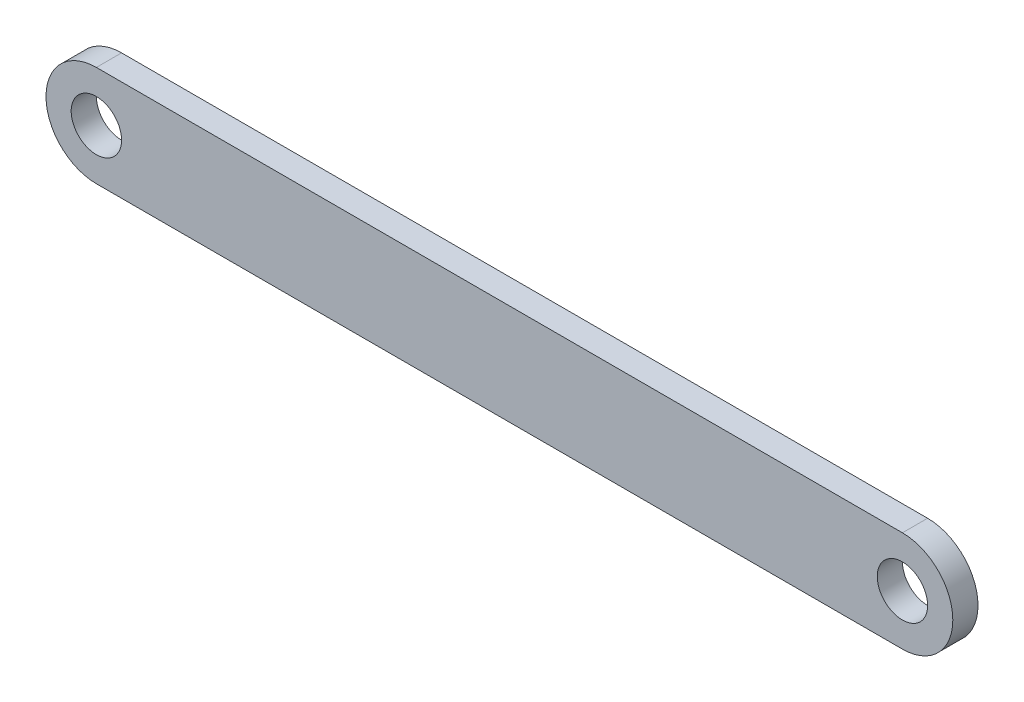
ISO-10303-21;
HEADER;
FILE_DESCRIPTION(('STEP AP214'),'2;1');
FILE_NAME('part.step','',(''),(''),'','','');
FILE_SCHEMA(('AUTOMOTIVE_DESIGN { 1 0 10303 214 1 1 1 1 }'));
ENDSEC;
DATA;
#1=APPLICATION_CONTEXT('core data for automotive mechanical design processes');
#2=APPLICATION_PROTOCOL_DEFINITION('international standard','automotive_design',2000,#1);
#3=PRODUCT_CONTEXT('',#1,'mechanical');
#4=PRODUCT('Part','Part','',(#3));
#5=PRODUCT_RELATED_PRODUCT_CATEGORY('part','',(#4));
#6=PRODUCT_DEFINITION_FORMATION('','',#4);
#7=PRODUCT_DEFINITION_CONTEXT('part definition',#1,'design');
#8=PRODUCT_DEFINITION('design','',#6,#7);
#9=PRODUCT_DEFINITION_SHAPE('','',#8);
#10=(LENGTH_UNIT() NAMED_UNIT(*) SI_UNIT(.MILLI.,.METRE.));
#11=(NAMED_UNIT(*) PLANE_ANGLE_UNIT() SI_UNIT($,.RADIAN.));
#12=(NAMED_UNIT(*) SI_UNIT($,.STERADIAN.) SOLID_ANGLE_UNIT());
#13=UNCERTAINTY_MEASURE_WITH_UNIT(LENGTH_MEASURE(1.E-05),#10,'distance_accuracy_value','');
#14=(GEOMETRIC_REPRESENTATION_CONTEXT(3) GLOBAL_UNCERTAINTY_ASSIGNED_CONTEXT((#13)) GLOBAL_UNIT_ASSIGNED_CONTEXT((#10,
#11,#12)) REPRESENTATION_CONTEXT('',''));
#15=CARTESIAN_POINT('',(0.,0.,0.));
#16=DIRECTION('',(0.,0.,1.));
#17=DIRECTION('',(1.,0.,0.));
#18=AXIS2_PLACEMENT_3D('',#15,#16,#17);
#19=CARTESIAN_POINT('',(-50.8,0.,3.175));
#20=DIRECTION('',(0.,0.,-1.));
#21=DIRECTION('',(-1.,0.,0.));
#22=AXIS2_PLACEMENT_3D('',#19,#20,#21);
#23=CYLINDRICAL_SURFACE('',#22,6.35);
#24=CARTESIAN_POINT('',(-50.8,0.,0.));
#25=DIRECTION('',(0.,0.,1.));
#26=DIRECTION('',(1.,0.,0.));
#27=AXIS2_PLACEMENT_3D('',#24,#25,#26);
#28=CIRCLE('',#27,6.35);
#29=CARTESIAN_POINT('',(-50.8,6.35,0.));
#30=VERTEX_POINT('',#29);
#31=CARTESIAN_POINT('',(-50.8,-6.35,0.));
#32=VERTEX_POINT('',#31);
#33=EDGE_CURVE('E106',#30,#32,#28,.T.);
#34=ORIENTED_EDGE('',*,*,#33,.T.);
#35=DIRECTION('',(0.,0.,-1.));
#36=VECTOR('',#35,1.);
#37=CARTESIAN_POINT('',(-50.8,-6.35,3.175));
#38=LINE('',#37,#36);
#39=CARTESIAN_POINT('',(-50.8,-6.35,3.175));
#40=VERTEX_POINT('',#39);
#41=EDGE_CURVE('E11',#40,#32,#38,.T.);
#42=ORIENTED_EDGE('',*,*,#41,.F.);
#43=CARTESIAN_POINT('',(-50.8,0.,3.175));
#44=DIRECTION('',(0.,0.,1.));
#45=DIRECTION('',(1.,0.,0.));
#46=AXIS2_PLACEMENT_3D('',#43,#44,#45);
#47=CIRCLE('',#46,6.35);
#48=CARTESIAN_POINT('',(-50.8,6.35,3.175));
#49=VERTEX_POINT('',#48);
#50=EDGE_CURVE('E90',#49,#40,#47,.T.);
#51=ORIENTED_EDGE('',*,*,#50,.F.);
#52=DIRECTION('',(0.,0.,-1.));
#53=VECTOR('',#52,1.);
#54=CARTESIAN_POINT('',(-50.8,6.35,3.175));
#55=LINE('',#54,#53);
#56=EDGE_CURVE('E102',#49,#30,#55,.T.);
#57=ORIENTED_EDGE('',*,*,#56,.T.);
#58=EDGE_LOOP('',(#34,#42,#51,#57));
#59=FACE_BOUND('',#58,.T.);
#60=ADVANCED_FACE('F38',(#59),#23,.T.);
#61=CARTESIAN_POINT('',(-50.8,-6.35,3.175));
#62=DIRECTION('',(0.,1.,0.));
#63=DIRECTION('',(0.,0.,1.));
#64=AXIS2_PLACEMENT_3D('',#61,#62,#63);
#65=PLANE('',#64);
#66=DIRECTION('',(1.,0.,0.));
#67=VECTOR('',#66,1.);
#68=CARTESIAN_POINT('',(-50.8,-6.35,0.));
#69=LINE('',#68,#67);
#70=CARTESIAN_POINT('',(50.8,-6.34999999999998,0.));
#71=VERTEX_POINT('',#70);
#72=EDGE_CURVE('E95',#32,#71,#69,.T.);
#73=ORIENTED_EDGE('',*,*,#72,.T.);
#74=DIRECTION('',(0.,0.,-1.));
#75=VECTOR('',#74,1.);
#76=CARTESIAN_POINT('',(50.8,-6.34999999999998,3.175));
#77=LINE('',#76,#75);
#78=CARTESIAN_POINT('',(50.8,-6.34999999999998,3.175));
#79=VERTEX_POINT('',#78);
#80=EDGE_CURVE('E47',#79,#71,#77,.T.);
#81=ORIENTED_EDGE('',*,*,#80,.F.);
#82=DIRECTION('',(1.,0.,0.));
#83=VECTOR('',#82,1.);
#84=CARTESIAN_POINT('',(-50.8,-6.35,3.175));
#85=LINE('',#84,#83);
#86=EDGE_CURVE('E85',#40,#79,#85,.T.);
#87=ORIENTED_EDGE('',*,*,#86,.F.);
#88=ORIENTED_EDGE('',*,*,#41,.T.);
#89=EDGE_LOOP('',(#73,#81,#87,#88));
#90=FACE_BOUND('',#89,.T.);
#91=ADVANCED_FACE('F94',(#90),#65,.F.);
#92=CARTESIAN_POINT('',(50.8,0.,3.175));
#93=DIRECTION('',(0.,0.,-1.));
#94=DIRECTION('',(-1.,0.,0.));
#95=AXIS2_PLACEMENT_3D('',#92,#93,#94);
#96=CYLINDRICAL_SURFACE('',#95,6.35);
#97=CARTESIAN_POINT('',(50.8,0.,0.));
#98=DIRECTION('',(0.,0.,1.));
#99=DIRECTION('',(1.,0.,0.));
#100=AXIS2_PLACEMENT_3D('',#97,#98,#99);
#101=CIRCLE('',#100,6.35);
#102=CARTESIAN_POINT('',(50.8,6.35,0.));
#103=VERTEX_POINT('',#102);
#104=EDGE_CURVE('E72',#71,#103,#101,.T.);
#105=ORIENTED_EDGE('',*,*,#104,.T.);
#106=DIRECTION('',(0.,0.,-1.));
#107=VECTOR('',#106,1.);
#108=CARTESIAN_POINT('',(50.8,6.35,3.175));
#109=LINE('',#108,#107);
#110=CARTESIAN_POINT('',(50.8,6.35,3.175));
#111=VERTEX_POINT('',#110);
#112=EDGE_CURVE('E97',#111,#103,#109,.T.);
#113=ORIENTED_EDGE('',*,*,#112,.F.);
#114=CARTESIAN_POINT('',(50.8,0.,3.175));
#115=DIRECTION('',(0.,0.,1.));
#116=DIRECTION('',(1.,0.,0.));
#117=AXIS2_PLACEMENT_3D('',#114,#115,#116);
#118=CIRCLE('',#117,6.35);
#119=EDGE_CURVE('E88',#79,#111,#118,.T.);
#120=ORIENTED_EDGE('',*,*,#119,.F.);
#121=ORIENTED_EDGE('',*,*,#80,.T.);
#122=EDGE_LOOP('',(#105,#113,#120,#121));
#123=FACE_BOUND('',#122,.T.);
#124=ADVANCED_FACE('F98',(#123),#96,.T.);
#125=CARTESIAN_POINT('',(-50.8,6.35,3.175));
#126=DIRECTION('',(0.,-1.,0.));
#127=DIRECTION('',(0.,0.,-1.));
#128=AXIS2_PLACEMENT_3D('',#125,#126,#127);
#129=PLANE('',#128);
#130=DIRECTION('',(-1.,0.,0.));
#131=VECTOR('',#130,1.);
#132=CARTESIAN_POINT('',(-50.8,6.35,0.));
#133=LINE('',#132,#131);
#134=EDGE_CURVE('E78',#103,#30,#133,.T.);
#135=ORIENTED_EDGE('',*,*,#134,.T.);
#136=ORIENTED_EDGE('',*,*,#56,.F.);
#137=DIRECTION('',(-1.,0.,0.));
#138=VECTOR('',#137,1.);
#139=CARTESIAN_POINT('',(-50.8,6.35,3.175));
#140=LINE('',#139,#138);
#141=EDGE_CURVE('E55',#111,#49,#140,.T.);
#142=ORIENTED_EDGE('',*,*,#141,.F.);
#143=ORIENTED_EDGE('',*,*,#112,.T.);
#144=EDGE_LOOP('',(#135,#136,#142,#143));
#145=FACE_BOUND('',#144,.T.);
#146=ADVANCED_FACE('F120',(#145),#129,.F.);
#147=CARTESIAN_POINT('',(-50.8,0.,3.175));
#148=DIRECTION('',(0.,0.,1.));
#149=DIRECTION('',(1.,0.,0.));
#150=AXIS2_PLACEMENT_3D('',#147,#148,#149);
#151=PLANE('',#150);
#152=CARTESIAN_POINT('',(-50.8,0.,3.175));
#153=DIRECTION('',(0.,0.,1.));
#154=DIRECTION('',(1.,0.,0.));
#155=AXIS2_PLACEMENT_3D('',#152,#153,#154);
#156=CIRCLE('',#155,3.175);
#157=CARTESIAN_POINT('',(-47.625,0.,3.175));
#158=VERTEX_POINT('',#157);
#159=EDGE_CURVE('E135',#158,#158,#156,.T.);
#160=ORIENTED_EDGE('',*,*,#159,.F.);
#161=EDGE_LOOP('',(#160));
#162=FACE_BOUND('',#161,.T.);
#163=CARTESIAN_POINT('',(50.8,0.,3.175));
#164=DIRECTION('',(0.,0.,1.));
#165=DIRECTION('',(-1.,0.,0.));
#166=AXIS2_PLACEMENT_3D('',#163,#164,#165);
#167=CIRCLE('',#166,3.175);
#168=CARTESIAN_POINT('',(47.625,0.,3.175));
#169=VERTEX_POINT('',#168);
#170=EDGE_CURVE('E127',#169,#169,#167,.T.);
#171=ORIENTED_EDGE('',*,*,#170,.F.);
#172=EDGE_LOOP('',(#171));
#173=FACE_BOUND('',#172,.T.);
#174=ORIENTED_EDGE('',*,*,#50,.T.);
#175=ORIENTED_EDGE('',*,*,#86,.T.);
#176=ORIENTED_EDGE('',*,*,#119,.T.);
#177=ORIENTED_EDGE('',*,*,#141,.T.);
#178=EDGE_LOOP('',(#174,#175,#176,#177));
#179=FACE_BOUND('',#178,.T.);
#180=ADVANCED_FACE('F86',(#162,#173,#179),#151,.T.);
#181=CARTESIAN_POINT('',(-50.8,0.,0.));
#182=DIRECTION('',(0.,0.,1.));
#183=DIRECTION('',(1.,0.,0.));
#184=AXIS2_PLACEMENT_3D('',#181,#182,#183);
#185=PLANE('',#184);
#186=CARTESIAN_POINT('',(-50.8,0.,0.));
#187=DIRECTION('',(0.,0.,1.));
#188=DIRECTION('',(1.,0.,0.));
#189=AXIS2_PLACEMENT_3D('',#186,#187,#188);
#190=CIRCLE('',#189,3.175);
#191=CARTESIAN_POINT('',(-47.625,0.,0.));
#192=VERTEX_POINT('',#191);
#193=EDGE_CURVE('E110',#192,#192,#190,.T.);
#194=ORIENTED_EDGE('',*,*,#193,.T.);
#195=EDGE_LOOP('',(#194));
#196=FACE_BOUND('',#195,.T.);
#197=CARTESIAN_POINT('',(50.8,0.,0.));
#198=DIRECTION('',(0.,0.,1.));
#199=DIRECTION('',(-1.,0.,0.));
#200=AXIS2_PLACEMENT_3D('',#197,#198,#199);
#201=CIRCLE('',#200,3.175);
#202=CARTESIAN_POINT('',(47.625,0.,0.));
#203=VERTEX_POINT('',#202);
#204=EDGE_CURVE('E131',#203,#203,#201,.T.);
#205=ORIENTED_EDGE('',*,*,#204,.T.);
#206=EDGE_LOOP('',(#205));
#207=FACE_BOUND('',#206,.T.);
#208=ORIENTED_EDGE('',*,*,#33,.F.);
#209=ORIENTED_EDGE('',*,*,#134,.F.);
#210=ORIENTED_EDGE('',*,*,#104,.F.);
#211=ORIENTED_EDGE('',*,*,#72,.F.);
#212=EDGE_LOOP('',(#208,#209,#210,#211));
#213=FACE_BOUND('',#212,.T.);
#214=ADVANCED_FACE('F123',(#196,#207,#213),#185,.F.);
#215=CARTESIAN_POINT('',(50.8,0.,0.));
#216=DIRECTION('',(0.,0.,1.));
#217=DIRECTION('',(1.,0.,0.));
#218=AXIS2_PLACEMENT_3D('',#215,#216,#217);
#219=CYLINDRICAL_SURFACE('',#218,3.175);
#220=ORIENTED_EDGE('',*,*,#204,.F.);
#221=EDGE_LOOP('',(#220));
#222=FACE_BOUND('',#221,.T.);
#223=ORIENTED_EDGE('',*,*,#170,.T.);
#224=EDGE_LOOP('',(#223));
#225=FACE_BOUND('',#224,.T.);
#226=ADVANCED_FACE('F148',(#222,#225),#219,.F.);
#227=CARTESIAN_POINT('',(-50.8,0.,0.));
#228=DIRECTION('',(0.,0.,1.));
#229=DIRECTION('',(1.,0.,0.));
#230=AXIS2_PLACEMENT_3D('',#227,#228,#229);
#231=CYLINDRICAL_SURFACE('',#230,3.175);
#232=ORIENTED_EDGE('',*,*,#193,.F.);
#233=EDGE_LOOP('',(#232));
#234=FACE_BOUND('',#233,.T.);
#235=ORIENTED_EDGE('',*,*,#159,.T.);
#236=EDGE_LOOP('',(#235));
#237=FACE_BOUND('',#236,.T.);
#238=ADVANCED_FACE('F145',(#234,#237),#231,.F.);
#239=CLOSED_SHELL('',(#60,#91,#124,#146,#180,#214,#226,#238));
#240=MANIFOLD_SOLID_BREP('B2',#239);
#241=ADVANCED_BREP_SHAPE_REPRESENTATION('',(#18,#240),#14);
#242=SHAPE_DEFINITION_REPRESENTATION(#9,#241);
ENDSEC;
END-ISO-10303-21;
